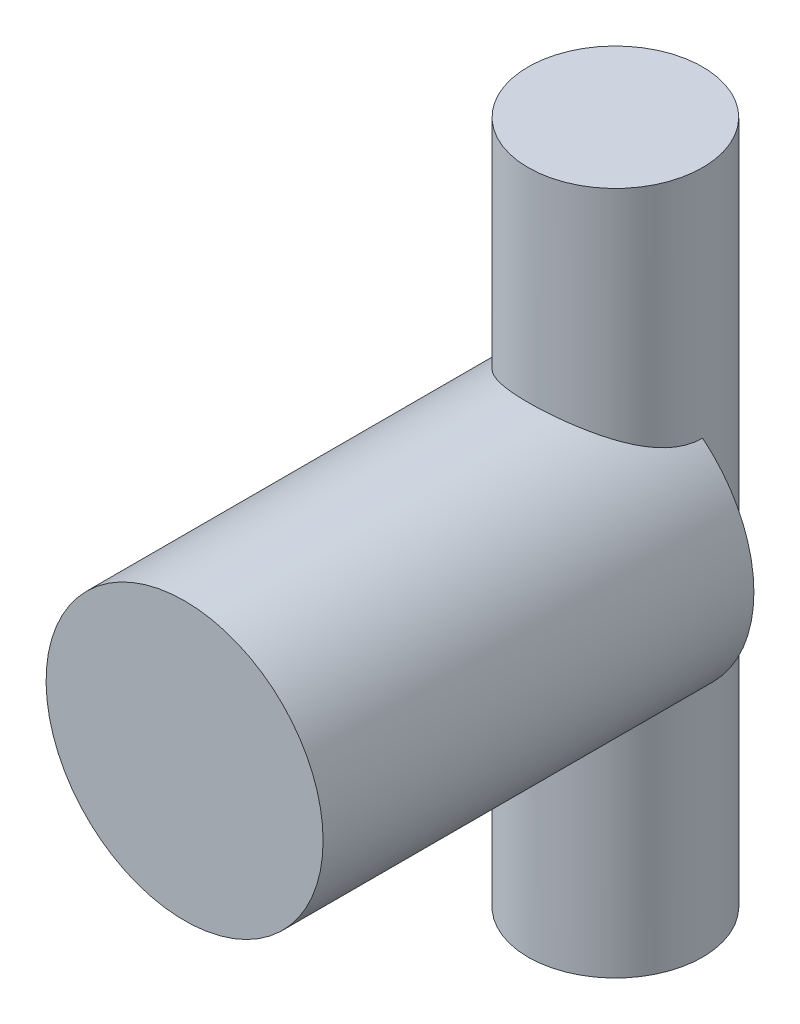
ISO-10303-21;
HEADER;
FILE_DESCRIPTION(('STEP AP214'),'2;1');
FILE_NAME('part.step','',(''),(''),'','','');
FILE_SCHEMA(('AUTOMOTIVE_DESIGN { 1 0 10303 214 1 1 1 1 }'));
ENDSEC;
DATA;
#1=APPLICATION_CONTEXT('core data for automotive mechanical design processes');
#2=APPLICATION_PROTOCOL_DEFINITION('international standard','automotive_design',2000,#1);
#3=PRODUCT_CONTEXT('',#1,'mechanical');
#4=PRODUCT('Part','Part','',(#3));
#5=PRODUCT_RELATED_PRODUCT_CATEGORY('part','',(#4));
#6=PRODUCT_DEFINITION_FORMATION('','',#4);
#7=PRODUCT_DEFINITION_CONTEXT('part definition',#1,'design');
#8=PRODUCT_DEFINITION('design','',#6,#7);
#9=PRODUCT_DEFINITION_SHAPE('','',#8);
#10=(LENGTH_UNIT() NAMED_UNIT(*) SI_UNIT(.MILLI.,.METRE.));
#11=(NAMED_UNIT(*) PLANE_ANGLE_UNIT() SI_UNIT($,.RADIAN.));
#12=(NAMED_UNIT(*) SI_UNIT($,.STERADIAN.) SOLID_ANGLE_UNIT());
#13=UNCERTAINTY_MEASURE_WITH_UNIT(LENGTH_MEASURE(1.E-05),#10,'distance_accuracy_value','');
#14=(GEOMETRIC_REPRESENTATION_CONTEXT(3) GLOBAL_UNCERTAINTY_ASSIGNED_CONTEXT((#13)) GLOBAL_UNIT_ASSIGNED_CONTEXT((#10,
#11,#12)) REPRESENTATION_CONTEXT('',''));
#15=CARTESIAN_POINT('',(0.,0.,0.));
#16=DIRECTION('',(0.,0.,1.));
#17=DIRECTION('',(1.,0.,0.));
#18=AXIS2_PLACEMENT_3D('',#15,#16,#17);
#19=CARTESIAN_POINT('',(0.,-31.35,0.));
#20=DIRECTION('',(0.,1.,0.));
#21=DIRECTION('',(0.,0.,1.));
#22=AXIS2_PLACEMENT_3D('',#19,#20,#21);
#23=CYLINDRICAL_SURFACE('',#22,8.);
#24=CARTESIAN_POINT('',(0.,31.35,0.));
#25=DIRECTION('',(0.,1.,0.));
#26=DIRECTION('',(0.,0.,1.));
#27=AXIS2_PLACEMENT_3D('',#24,#25,#26);
#28=CIRCLE('',#27,8.);
#29=CARTESIAN_POINT('',(0.,31.35,8.));
#30=VERTEX_POINT('',#29);
#31=EDGE_CURVE('E102',#30,#30,#28,.T.);
#32=ORIENTED_EDGE('',*,*,#31,.F.);
#33=EDGE_LOOP('',(#32));
#34=FACE_BOUND('',#33,.T.);
#35=CARTESIAN_POINT('',(0.,-31.35,0.));
#36=DIRECTION('',(0.,1.,0.));
#37=DIRECTION('',(0.,0.,1.));
#38=AXIS2_PLACEMENT_3D('',#35,#36,#37);
#39=CIRCLE('',#38,8.);
#40=CARTESIAN_POINT('',(0.,-31.35,8.));
#41=VERTEX_POINT('',#40);
#42=EDGE_CURVE('E100',#41,#41,#39,.T.);
#43=ORIENTED_EDGE('',*,*,#42,.T.);
#44=EDGE_LOOP('',(#43));
#45=FACE_BOUND('',#44,.T.);
#46=CARTESIAN_POINT('',(-8.,9.86356933366416,0.));
#47=CARTESIAN_POINT('',(-8.0000013583931,9.86356538609445,0.0999340040330633));
#48=CARTESIAN_POINT('',(-7.99812697497432,9.86508880779933,0.199851989471545));
#49=CARTESIAN_POINT('',(-7.99064530081715,9.87115098397328,0.399448530457239));
#50=CARTESIAN_POINT('',(-7.98503831447454,9.87568949256032,0.499127104863357));
#51=CARTESIAN_POINT('',(-7.96266629229384,9.89375242234983,0.797244738318202));
#52=CARTESIAN_POINT('',(-7.94035008220132,9.91172446304718,0.995040463155773));
#53=CARTESIAN_POINT('',(-7.8815875510473,9.95851182041843,1.38535699170974));
#54=CARTESIAN_POINT('',(-7.84526726993735,9.98723035001433,1.57790889333046));
#55=CARTESIAN_POINT('',(-7.75907448726431,10.0543394069116,1.95826394279498));
#56=CARTESIAN_POINT('',(-7.70919877581066,10.0927322249021,2.14606595434924));
#57=CARTESIAN_POINT('',(-7.59682154773078,10.1775845472453,2.51502217000494));
#58=CARTESIAN_POINT('',(-7.53437594750506,10.2240082026203,2.69620175772222));
#59=CARTESIAN_POINT('',(-7.39741433982669,10.3235376075616,3.0519839399364));
#60=CARTESIAN_POINT('',(-7.32289879496086,10.3766431010255,3.22658678617431));
#61=CARTESIAN_POINT('',(-7.0818152944499,10.5440114167543,3.74049303445845));
#62=CARTESIAN_POINT('',(-6.89791646850363,10.666163266687,4.06922796624266));
#63=CARTESIAN_POINT('',(-6.46033989933895,10.9374940771768,4.73756337334191));
#64=CARTESIAN_POINT('',(-6.2005849553995,11.0880929026901,5.07260601584993));
#65=CARTESIAN_POINT('',(-5.77380499074867,11.3127887896684,5.54146859865225));
#66=CARTESIAN_POINT('',(-5.62527096328437,11.3875237421458,5.6922055221851));
#67=CARTESIAN_POINT('',(-5.3161375183862,11.5350760323423,5.98193600663788));
#68=CARTESIAN_POINT('',(-5.1555354941188,11.6078929511285,6.12092701644198));
#69=CARTESIAN_POINT('',(-4.80217784928883,11.7588451381697,6.40283604574296));
#70=CARTESIAN_POINT('',(-4.60790454685757,11.8365203362191,6.54410409821342));
#71=CARTESIAN_POINT('',(-4.20574821338819,11.9853084147721,6.80952930415407));
#72=CARTESIAN_POINT('',(-3.99787147399129,12.0564242928254,6.93369428650118));
#73=CARTESIAN_POINT('',(-3.56962153433164,12.1900816331786,7.16357671182948));
#74=CARTESIAN_POINT('',(-3.34925349775488,12.2526266025256,7.26930170495064));
#75=CARTESIAN_POINT('',(-2.89744168653597,12.3672596540738,7.4608985410082));
#76=CARTESIAN_POINT('',(-2.66599997677757,12.4193496764481,7.54677406795197));
#77=CARTESIAN_POINT('',(-2.21825633980463,12.5066337312416,7.68952101717642));
#78=CARTESIAN_POINT('',(-2.00284672411274,12.5430147335984,7.74846753542348));
#79=CARTESIAN_POINT('',(-1.56635616171564,12.6049631326752,7.84835235717033));
#80=CARTESIAN_POINT('',(-1.34527556906699,12.6305312027456,7.88929178202639));
#81=CARTESIAN_POINT('',(-0.89962692948676,12.6700698337796,7.95243832580891));
#82=CARTESIAN_POINT('',(-0.675062181787602,12.6840507566206,7.97466218153492));
#83=CARTESIAN_POINT('',(-0.224442058753587,12.7000169262057,8.00003318724611));
#84=CARTESIAN_POINT('',(0.0016131376601048,12.7020035874702,8.00318258674087));
#85=CARTESIAN_POINT('',(0.422118160470766,12.6944802333657,7.99123500452226));
#86=CARTESIAN_POINT('',(0.616670471038445,12.6865024008374,7.97856981861391));
#87=CARTESIAN_POINT('',(1.00378008030582,12.6617547386782,7.93916054758022));
#88=CARTESIAN_POINT('',(1.19633740261343,12.6449850132085,7.91241662925167));
#89=CARTESIAN_POINT('',(1.57809768033974,12.6030349087022,7.84520089291667));
#90=CARTESIAN_POINT('',(1.76730066320308,12.577854598513,7.80472918728328));
#91=CARTESIAN_POINT('',(2.14114442279097,12.5196364516018,7.71055543822061));
#92=CARTESIAN_POINT('',(2.3257850062425,12.4865982826318,7.65685283535575));
#93=CARTESIAN_POINT('',(2.68973956448829,12.4132915432527,7.53671532209322));
#94=CARTESIAN_POINT('',(2.86904444725243,12.3730113723275,7.47025997218267));
#95=CARTESIAN_POINT('',(3.22114888093445,12.2860548156019,7.3253321163929));
#96=CARTESIAN_POINT('',(3.39394625173961,12.2393763101415,7.24685562709668));
#97=CARTESIAN_POINT('',(3.90131807152531,12.091054297621,6.99444310307345));
#98=CARTESIAN_POINT('',(4.22514704208937,11.9810669206789,6.80343212358224));
#99=CARTESIAN_POINT('',(4.87773355280367,11.7317843095583,6.3548282112224));
#100=CARTESIAN_POINT('',(5.20203317984518,11.5905438128513,6.09189358410025));
#101=CARTESIAN_POINT('',(5.8050383877736,11.3005980408462,5.52035752591849));
#102=CARTESIAN_POINT('',(6.08365846578021,11.1518794325789,5.21167246916012));
#103=CARTESIAN_POINT('',(6.48099710883098,10.9231115472125,4.6959834182263));
#104=CARTESIAN_POINT('',(6.61677240988847,10.8411689871381,4.50270925227893));
#105=CARTESIAN_POINT('',(6.8714585264226,10.6815544975497,4.10354581025102));
#106=CARTESIAN_POINT('',(6.99036656373073,10.6038832728448,3.89765446400224));
#107=CARTESIAN_POINT('',(7.20986333141857,10.4558762465436,3.47482623031888));
#108=CARTESIAN_POINT('',(7.31051613316535,10.3855151748549,3.25793153346702));
#109=CARTESIAN_POINT('',(7.49282202987213,10.2547653278108,2.8134092788525));
#110=CARTESIAN_POINT('',(7.57448085147931,10.1943735483318,2.58578498099988));
#111=CARTESIAN_POINT('',(7.70338661609015,10.097178257383,2.16700912019942));
#112=CARTESIAN_POINT('',(7.75424333212428,10.0580715778173,1.97749991602768));
#113=CARTESIAN_POINT('',(7.84213844034497,9.98969327519272,1.59361694277257));
#114=CARTESIAN_POINT('',(7.87918226035909,9.96041778938101,1.3992451165816));
#115=CARTESIAN_POINT('',(7.93912692809494,9.91270715041063,1.00514609495443));
#116=CARTESIAN_POINT('',(7.96189737887714,9.89437201571446,0.805386431578536));
#117=CARTESIAN_POINT('',(7.98472852581757,9.87594013850921,0.50426259518792));
#118=CARTESIAN_POINT('',(7.99045152006019,9.87130791933472,0.403561736536073));
#119=CARTESIAN_POINT('',(7.99808814620443,9.86512031239074,0.201912739115056));
#120=CARTESIAN_POINT('',(8.00000144447202,9.86356519409837,0.100964579463531));
#121=CARTESIAN_POINT('',(8.,9.86356933366416,0.));
#122=B_SPLINE_CURVE_WITH_KNOTS('',3,(#46,#47,#48,#49,#50,#51,#52,#53,#54,#55,#56,#57,#58,#59,
#60,#61,#62,#63,#64,#65,#66,#67,#68,#69,#70,#71,#72,#73,#74,#75,#76,#77,#78,#79,#80,#81,#82,#83,
#84,#85,#86,#87,#88,#89,#90,#91,#92,#93,#94,#95,#96,#97,#98,#99,#100,#101,#102,#103,#104,#105,
#106,#107,#108,#109,#110,#111,#112,#113,#114,#115,#116,#117,#118,#119,#120,#121),.UNSPECIFIED.,
.F.,.F.,(4,2,2,2,2,2,2,2,2,2,2,2,2,2,2,2,2,2,2,2,2,2,2,2,2,2,2,2,2,2,2,2,2,2,2,2,2,4),(0.,
0.299741459845055,0.599458478605483,1.19807168380783,1.7914184609502,2.38490586366248,
2.97580930696665,3.56669010894948,4.75057792473669,6.09479864257493,6.76757573994624,
7.44049858542572,8.19685924701747,8.95287252808414,9.70857553377098,10.4641381701964,
11.141962820217,11.819745254065,12.4969209208256,13.1740167246112,13.7586949808458,
14.3433663103016,14.9280328538643,15.5127241228411,16.0983604552391,16.6841912700722,
17.8549758265967,19.1723262817367,20.4921150733266,21.2413713723686,21.9907509367667,
22.7374471980263,23.4839180391932,24.0834237257571,24.6826935855054,25.2873613104177,
25.5901662977819,25.8929978021195),.UNSPECIFIED.);
#123=CARTESIAN_POINT('',(-8.,9.86356933366416,0.));
#124=VERTEX_POINT('',#123);
#125=CARTESIAN_POINT('',(8.,9.86356933366416,0.));
#126=VERTEX_POINT('',#125);
#127=EDGE_CURVE('E42',#124,#126,#122,.T.);
#128=ORIENTED_EDGE('',*,*,#127,.T.);
#129=DIRECTION('',(0.,1.,0.));
#130=VECTOR('',#129,1.);
#131=CARTESIAN_POINT('',(8.,-31.35,0.));
#132=LINE('',#131,#130);
#133=CARTESIAN_POINT('',(8.,-9.86356933366416,0.));
#134=VERTEX_POINT('',#133);
#135=EDGE_CURVE('E11',#126,#134,#132,.F.);
#136=ORIENTED_EDGE('',*,*,#135,.T.);
#137=CARTESIAN_POINT('',(8.,-9.86356933366416,0.));
#138=CARTESIAN_POINT('',(8.0000013583931,-9.86356538609445,0.0999340040330633));
#139=CARTESIAN_POINT('',(7.99812697497432,-9.86508880779933,0.199851989471545));
#140=CARTESIAN_POINT('',(7.99064530081715,-9.87115098397328,0.399448530457239));
#141=CARTESIAN_POINT('',(7.98503831447454,-9.87568949256032,0.499127104863357));
#142=CARTESIAN_POINT('',(7.96266629229384,-9.89375242234983,0.797244738318202));
#143=CARTESIAN_POINT('',(7.94035008220132,-9.91172446304718,0.995040463155773));
#144=CARTESIAN_POINT('',(7.8815875510473,-9.95851182041843,1.38535699170974));
#145=CARTESIAN_POINT('',(7.84526726993735,-9.98723035001433,1.57790889333046));
#146=CARTESIAN_POINT('',(7.75907448726431,-10.0543394069116,1.95826394279498));
#147=CARTESIAN_POINT('',(7.70919877581066,-10.0927322249021,2.14606595434924));
#148=CARTESIAN_POINT('',(7.59682154773078,-10.1775845472453,2.51502217000494));
#149=CARTESIAN_POINT('',(7.53437594750506,-10.2240082026203,2.69620175772222));
#150=CARTESIAN_POINT('',(7.39741433982669,-10.3235376075616,3.0519839399364));
#151=CARTESIAN_POINT('',(7.32289879496086,-10.3766431010255,3.22658678617431));
#152=CARTESIAN_POINT('',(7.0818152944499,-10.5440114167543,3.74049303445845));
#153=CARTESIAN_POINT('',(6.89791646850363,-10.666163266687,4.06922796624266));
#154=CARTESIAN_POINT('',(6.46033989933895,-10.9374940771768,4.73756337334191));
#155=CARTESIAN_POINT('',(6.2005849553995,-11.0880929026901,5.07260601584993));
#156=CARTESIAN_POINT('',(5.77380499074867,-11.3127887896684,5.54146859865225));
#157=CARTESIAN_POINT('',(5.62527096328437,-11.3875237421458,5.6922055221851));
#158=CARTESIAN_POINT('',(5.3161375183862,-11.5350760323423,5.98193600663788));
#159=CARTESIAN_POINT('',(5.1555354941188,-11.6078929511285,6.12092701644198));
#160=CARTESIAN_POINT('',(4.80217784928883,-11.7588451381697,6.40283604574296));
#161=CARTESIAN_POINT('',(4.60790454685757,-11.8365203362191,6.54410409821342));
#162=CARTESIAN_POINT('',(4.20574821338819,-11.9853084147721,6.80952930415407));
#163=CARTESIAN_POINT('',(3.99787147399129,-12.0564242928254,6.93369428650118));
#164=CARTESIAN_POINT('',(3.56962153433164,-12.1900816331786,7.16357671182948));
#165=CARTESIAN_POINT('',(3.34925349775488,-12.2526266025256,7.26930170495064));
#166=CARTESIAN_POINT('',(2.89744168653597,-12.3672596540738,7.4608985410082));
#167=CARTESIAN_POINT('',(2.66599997677757,-12.4193496764481,7.54677406795197));
#168=CARTESIAN_POINT('',(2.21825633980463,-12.5066337312416,7.68952101717642));
#169=CARTESIAN_POINT('',(2.00284672411274,-12.5430147335984,7.74846753542348));
#170=CARTESIAN_POINT('',(1.56635616171564,-12.6049631326752,7.84835235717033));
#171=CARTESIAN_POINT('',(1.34527556906699,-12.6305312027456,7.88929178202639));
#172=CARTESIAN_POINT('',(0.89962692948676,-12.6700698337796,7.95243832580891));
#173=CARTESIAN_POINT('',(0.675062181787602,-12.6840507566206,7.97466218153492));
#174=CARTESIAN_POINT('',(0.224442058753587,-12.7000169262057,8.00003318724611));
#175=CARTESIAN_POINT('',(-0.0016131376601048,-12.7020035874702,8.00318258674087));
#176=CARTESIAN_POINT('',(-0.422118160470766,-12.6944802333657,7.99123500452226));
#177=CARTESIAN_POINT('',(-0.616670471038445,-12.6865024008374,7.97856981861391));
#178=CARTESIAN_POINT('',(-1.00378008030582,-12.6617547386782,7.93916054758022));
#179=CARTESIAN_POINT('',(-1.19633740261343,-12.6449850132085,7.91241662925167));
#180=CARTESIAN_POINT('',(-1.57809768033974,-12.6030349087022,7.84520089291667));
#181=CARTESIAN_POINT('',(-1.76730066320308,-12.577854598513,7.80472918728328));
#182=CARTESIAN_POINT('',(-2.14114442279097,-12.5196364516018,7.71055543822061));
#183=CARTESIAN_POINT('',(-2.3257850062425,-12.4865982826318,7.65685283535575));
#184=CARTESIAN_POINT('',(-2.68973956448829,-12.4132915432527,7.53671532209322));
#185=CARTESIAN_POINT('',(-2.86904444725243,-12.3730113723275,7.47025997218267));
#186=CARTESIAN_POINT('',(-3.22114888093445,-12.2860548156019,7.3253321163929));
#187=CARTESIAN_POINT('',(-3.39394625173961,-12.2393763101415,7.24685562709668));
#188=CARTESIAN_POINT('',(-3.90131807152531,-12.091054297621,6.99444310307345));
#189=CARTESIAN_POINT('',(-4.22514704208937,-11.9810669206789,6.80343212358224));
#190=CARTESIAN_POINT('',(-4.87773355280367,-11.7317843095583,6.3548282112224));
#191=CARTESIAN_POINT('',(-5.20203317984518,-11.5905438128513,6.09189358410025));
#192=CARTESIAN_POINT('',(-5.8050383877736,-11.3005980408462,5.52035752591849));
#193=CARTESIAN_POINT('',(-6.08365846578021,-11.1518794325789,5.21167246916012));
#194=CARTESIAN_POINT('',(-6.48099710883098,-10.9231115472125,4.6959834182263));
#195=CARTESIAN_POINT('',(-6.61677240988847,-10.8411689871381,4.50270925227893));
#196=CARTESIAN_POINT('',(-6.8714585264226,-10.6815544975497,4.10354581025102));
#197=CARTESIAN_POINT('',(-6.99036656373073,-10.6038832728448,3.89765446400224));
#198=CARTESIAN_POINT('',(-7.20986333141857,-10.4558762465436,3.47482623031888));
#199=CARTESIAN_POINT('',(-7.31051613316535,-10.3855151748549,3.25793153346702));
#200=CARTESIAN_POINT('',(-7.49282202987213,-10.2547653278108,2.8134092788525));
#201=CARTESIAN_POINT('',(-7.57448085147931,-10.1943735483318,2.58578498099988));
#202=CARTESIAN_POINT('',(-7.70338661609015,-10.097178257383,2.16700912019942));
#203=CARTESIAN_POINT('',(-7.75424333212428,-10.0580715778173,1.97749991602768));
#204=CARTESIAN_POINT('',(-7.84213844034497,-9.98969327519272,1.59361694277257));
#205=CARTESIAN_POINT('',(-7.87918226035909,-9.96041778938101,1.3992451165816));
#206=CARTESIAN_POINT('',(-7.93912692809494,-9.91270715041063,1.00514609495443));
#207=CARTESIAN_POINT('',(-7.96189737887714,-9.89437201571446,0.805386431578536));
#208=CARTESIAN_POINT('',(-7.98472852581757,-9.87594013850921,0.50426259518792));
#209=CARTESIAN_POINT('',(-7.99045152006019,-9.87130791933472,0.403561736536073));
#210=CARTESIAN_POINT('',(-7.99808814620443,-9.86512031239074,0.201912739115056));
#211=CARTESIAN_POINT('',(-8.00000144447202,-9.86356519409837,0.100964579463531));
#212=CARTESIAN_POINT('',(-8.,-9.86356933366416,0.));
#213=B_SPLINE_CURVE_WITH_KNOTS('',3,(#137,#138,#139,#140,#141,#142,#143,#144,#145,#146,#147,
#148,#149,#150,#151,#152,#153,#154,#155,#156,#157,#158,#159,#160,#161,#162,#163,#164,#165,#166,
#167,#168,#169,#170,#171,#172,#173,#174,#175,#176,#177,#178,#179,#180,#181,#182,#183,#184,#185,
#186,#187,#188,#189,#190,#191,#192,#193,#194,#195,#196,#197,#198,#199,#200,#201,#202,#203,#204,
#205,#206,#207,#208,#209,#210,#211,#212),.UNSPECIFIED.,.F.,.F.,(4,2,2,2,2,2,2,2,2,2,2,2,2,2,2,2,
2,2,2,2,2,2,2,2,2,2,2,2,2,2,2,2,2,2,2,2,2,4),(0.,0.299741459845055,0.599458478605483,
1.19807168380783,1.7914184609502,2.38490586366248,2.97580930696665,3.56669010894948,
4.75057792473669,6.09479864257493,6.76757573994624,7.44049858542572,8.19685924701747,
8.95287252808414,9.70857553377098,10.4641381701964,11.141962820217,11.819745254065,
12.4969209208256,13.1740167246112,13.7586949808458,14.3433663103016,14.9280328538643,
15.5127241228411,16.0983604552391,16.6841912700722,17.8549758265967,19.1723262817367,
20.4921150733266,21.2413713723686,21.9907509367667,22.7374471980263,23.4839180391932,
24.0834237257571,24.6826935855054,25.2873613104177,25.5901662977819,25.8929978021195),.UNSPECIFIED.);
#214=CARTESIAN_POINT('',(-8.,-9.86356933366416,0.));
#215=VERTEX_POINT('',#214);
#216=EDGE_CURVE('E55',#134,#215,#213,.T.);
#217=ORIENTED_EDGE('',*,*,#216,.T.);
#218=DIRECTION('',(0.,1.,0.));
#219=VECTOR('',#218,1.);
#220=CARTESIAN_POINT('',(-8.,-31.35,0.));
#221=LINE('',#220,#219);
#222=EDGE_CURVE('E70',#215,#124,#221,.T.);
#223=ORIENTED_EDGE('',*,*,#222,.T.);
#224=EDGE_LOOP('',(#128,#136,#217,#223));
#225=FACE_BOUND('',#224,.T.);
#226=ADVANCED_FACE('F34',(#34,#45,#225),#23,.T.);
#227=CARTESIAN_POINT('',(0.,-31.35,0.));
#228=DIRECTION('',(0.,1.,0.));
#229=DIRECTION('',(0.,0.,1.));
#230=AXIS2_PLACEMENT_3D('',#227,#228,#229);
#231=PLANE('',#230);
#232=ORIENTED_EDGE('',*,*,#42,.F.);
#233=EDGE_LOOP('',(#232));
#234=FACE_BOUND('',#233,.T.);
#235=ADVANCED_FACE('F90',(#234),#231,.F.);
#236=CARTESIAN_POINT('',(0.,31.35,0.));
#237=DIRECTION('',(0.,1.,0.));
#238=DIRECTION('',(0.,0.,1.));
#239=AXIS2_PLACEMENT_3D('',#236,#237,#238);
#240=PLANE('',#239);
#241=ORIENTED_EDGE('',*,*,#31,.T.);
#242=EDGE_LOOP('',(#241));
#243=FACE_BOUND('',#242,.T.);
#244=ADVANCED_FACE('F87',(#243),#240,.T.);
#245=CARTESIAN_POINT('',(0.,0.,0.));
#246=DIRECTION('',(0.,0.,1.));
#247=DIRECTION('',(1.,0.,0.));
#248=AXIS2_PLACEMENT_3D('',#245,#246,#247);
#249=PLANE('',#248);
#250=ORIENTED_EDGE('',*,*,#135,.F.);
#251=CARTESIAN_POINT('',(0.,0.,0.));
#252=DIRECTION('',(0.,0.,1.));
#253=DIRECTION('',(1.,0.,0.));
#254=AXIS2_PLACEMENT_3D('',#251,#252,#253);
#255=CIRCLE('',#254,12.7);
#256=EDGE_CURVE('E63',#134,#126,#255,.T.);
#257=ORIENTED_EDGE('',*,*,#256,.F.);
#258=EDGE_LOOP('',(#250,#257));
#259=FACE_BOUND('',#258,.T.);
#260=ADVANCED_FACE('F62',(#259),#249,.F.);
#261=CARTESIAN_POINT('',(0.,0.,39.5));
#262=DIRECTION('',(0.,0.,-1.));
#263=DIRECTION('',(-1.,0.,0.));
#264=AXIS2_PLACEMENT_3D('',#261,#262,#263);
#265=CYLINDRICAL_SURFACE('',#264,12.7);
#266=ORIENTED_EDGE('',*,*,#127,.F.);
#267=EDGE_CURVE('E48',#124,#215,#255,.T.);
#268=ORIENTED_EDGE('',*,*,#267,.T.);
#269=ORIENTED_EDGE('',*,*,#216,.F.);
#270=ORIENTED_EDGE('',*,*,#256,.T.);
#271=EDGE_LOOP('',(#266,#268,#269,#270));
#272=FACE_BOUND('',#271,.T.);
#273=CARTESIAN_POINT('',(0.,0.,39.5));
#274=DIRECTION('',(0.,0.,1.));
#275=DIRECTION('',(1.,0.,0.));
#276=AXIS2_PLACEMENT_3D('',#273,#274,#275);
#277=CIRCLE('',#276,12.7);
#278=CARTESIAN_POINT('',(12.7,0.,39.5));
#279=VERTEX_POINT('',#278);
#280=EDGE_CURVE('E105',#279,#279,#277,.T.);
#281=ORIENTED_EDGE('',*,*,#280,.F.);
#282=EDGE_LOOP('',(#281));
#283=FACE_BOUND('',#282,.T.);
#284=ADVANCED_FACE('F66',(#272,#283),#265,.T.);
#285=CARTESIAN_POINT('',(0.,0.,39.5));
#286=DIRECTION('',(0.,0.,1.));
#287=DIRECTION('',(1.,0.,0.));
#288=AXIS2_PLACEMENT_3D('',#285,#286,#287);
#289=PLANE('',#288);
#290=ORIENTED_EDGE('',*,*,#280,.T.);
#291=EDGE_LOOP('',(#290));
#292=FACE_BOUND('',#291,.T.);
#293=ADVANCED_FACE('F84',(#292),#289,.T.);
#294=ORIENTED_EDGE('',*,*,#222,.F.);
#295=ORIENTED_EDGE('',*,*,#267,.F.);
#296=EDGE_LOOP('',(#294,#295));
#297=FACE_BOUND('',#296,.T.);
#298=ADVANCED_FACE('F85',(#297),#249,.F.);
#299=CLOSED_SHELL('',(#226,#235,#244,#260,#284,#293,#298));
#300=MANIFOLD_SOLID_BREP('B2',#299);
#301=ADVANCED_BREP_SHAPE_REPRESENTATION('',(#18,#300),#14);
#302=SHAPE_DEFINITION_REPRESENTATION(#9,#301);
ENDSEC;
END-ISO-10303-21;
